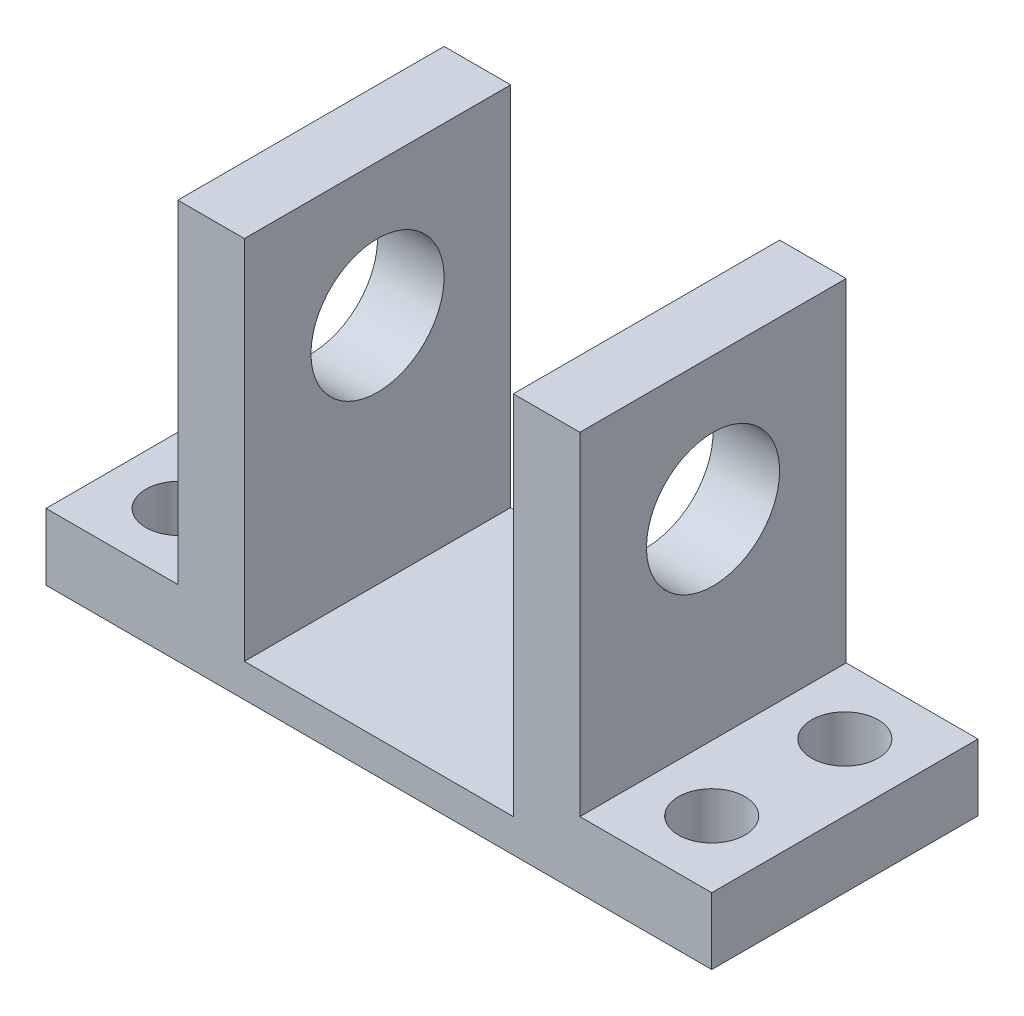
ISO-10303-21;
HEADER;
FILE_DESCRIPTION(('STEP AP214'),'2;1');
FILE_NAME('part.step','',(''),(''),'','','');
FILE_SCHEMA(('AUTOMOTIVE_DESIGN { 1 0 10303 214 1 1 1 1 }'));
ENDSEC;
DATA;
#1=APPLICATION_CONTEXT('core data for automotive mechanical design processes');
#2=APPLICATION_PROTOCOL_DEFINITION('international standard','automotive_design',2000,#1);
#3=PRODUCT_CONTEXT('',#1,'mechanical');
#4=PRODUCT('Part','Part','',(#3));
#5=PRODUCT_RELATED_PRODUCT_CATEGORY('part','',(#4));
#6=PRODUCT_DEFINITION_FORMATION('','',#4);
#7=PRODUCT_DEFINITION_CONTEXT('part definition',#1,'design');
#8=PRODUCT_DEFINITION('design','',#6,#7);
#9=PRODUCT_DEFINITION_SHAPE('','',#8);
#10=(LENGTH_UNIT() NAMED_UNIT(*) SI_UNIT(.MILLI.,.METRE.));
#11=(NAMED_UNIT(*) PLANE_ANGLE_UNIT() SI_UNIT($,.RADIAN.));
#12=(NAMED_UNIT(*) SI_UNIT($,.STERADIAN.) SOLID_ANGLE_UNIT());
#13=UNCERTAINTY_MEASURE_WITH_UNIT(LENGTH_MEASURE(1.E-05),#10,'distance_accuracy_value','');
#14=(GEOMETRIC_REPRESENTATION_CONTEXT(3) GLOBAL_UNCERTAINTY_ASSIGNED_CONTEXT((#13)) GLOBAL_UNIT_ASSIGNED_CONTEXT((#10,
#11,#12)) REPRESENTATION_CONTEXT('',''));
#15=CARTESIAN_POINT('',(0.,0.,0.));
#16=DIRECTION('',(0.,0.,1.));
#17=DIRECTION('',(1.,0.,0.));
#18=AXIS2_PLACEMENT_3D('',#15,#16,#17);
#19=CARTESIAN_POINT('',(-12.7,6.35,-25.4));
#20=DIRECTION('',(0.,-1.,0.));
#21=DIRECTION('',(0.,0.,-1.));
#22=AXIS2_PLACEMENT_3D('',#19,#20,#21);
#23=PLANE('',#22);
#24=CARTESIAN_POINT('',(-6.35,6.35,-6.35));
#25=DIRECTION('',(0.,1.,0.));
#26=DIRECTION('',(0.,0.,1.));
#27=AXIS2_PLACEMENT_3D('',#24,#25,#26);
#28=CIRCLE('',#27,3.175);
#29=CARTESIAN_POINT('',(-6.35,6.35,-3.175));
#30=VERTEX_POINT('',#29);
#31=EDGE_CURVE('E194',#30,#30,#28,.T.);
#32=ORIENTED_EDGE('',*,*,#31,.F.);
#33=EDGE_LOOP('',(#32));
#34=FACE_BOUND('',#33,.T.);
#35=CARTESIAN_POINT('',(-6.35,6.35,-19.05));
#36=DIRECTION('',(0.,1.,0.));
#37=DIRECTION('',(0.,0.,1.));
#38=AXIS2_PLACEMENT_3D('',#35,#36,#37);
#39=CIRCLE('',#38,3.175);
#40=CARTESIAN_POINT('',(-6.35,6.35,-15.875));
#41=VERTEX_POINT('',#40);
#42=EDGE_CURVE('E188',#41,#41,#39,.T.);
#43=ORIENTED_EDGE('',*,*,#42,.F.);
#44=EDGE_LOOP('',(#43));
#45=FACE_BOUND('',#44,.T.);
#46=DIRECTION('',(0.,0.,1.));
#47=VECTOR('',#46,1.);
#48=CARTESIAN_POINT('',(-0.127,6.35,-25.4));
#49=LINE('',#48,#47);
#50=CARTESIAN_POINT('',(-0.127,6.35,-25.4));
#51=VERTEX_POINT('',#50);
#52=CARTESIAN_POINT('',(-0.127,6.35,0.));
#53=VERTEX_POINT('',#52);
#54=EDGE_CURVE('E57',#51,#53,#49,.T.);
#55=ORIENTED_EDGE('',*,*,#54,.F.);
#56=DIRECTION('',(1.,0.,0.));
#57=VECTOR('',#56,1.);
#58=CARTESIAN_POINT('',(-12.7,6.35,-25.4));
#59=LINE('',#58,#57);
#60=CARTESIAN_POINT('',(-12.7,6.35,-25.4));
#61=VERTEX_POINT('',#60);
#62=EDGE_CURVE('E231',#61,#51,#59,.T.);
#63=ORIENTED_EDGE('',*,*,#62,.F.);
#64=DIRECTION('',(0.,0.,-1.));
#65=VECTOR('',#64,1.);
#66=CARTESIAN_POINT('',(-12.7,6.35,-25.4));
#67=LINE('',#66,#65);
#68=CARTESIAN_POINT('',(-12.7,6.35,0.));
#69=VERTEX_POINT('',#68);
#70=EDGE_CURVE('E229',#69,#61,#67,.T.);
#71=ORIENTED_EDGE('',*,*,#70,.F.);
#72=DIRECTION('',(1.,0.,0.));
#73=VECTOR('',#72,1.);
#74=CARTESIAN_POINT('',(-12.7,6.35,0.));
#75=LINE('',#74,#73);
#76=EDGE_CURVE('E53',#69,#53,#75,.T.);
#77=ORIENTED_EDGE('',*,*,#76,.T.);
#78=EDGE_LOOP('',(#55,#63,#71,#77));
#79=FACE_BOUND('',#78,.T.);
#80=ADVANCED_FACE('F36',(#34,#45,#79),#23,.F.);
#81=CARTESIAN_POINT('',(50.8,6.35,0.));
#82=DIRECTION('',(0.,-1.,0.));
#83=DIRECTION('',(0.,0.,-1.));
#84=AXIS2_PLACEMENT_3D('',#81,#82,#83);
#85=PLANE('',#84);
#86=CARTESIAN_POINT('',(44.45,6.35,-19.05));
#87=DIRECTION('',(0.,1.,0.));
#88=DIRECTION('',(0.,0.,1.));
#89=AXIS2_PLACEMENT_3D('',#86,#87,#88);
#90=CIRCLE('',#89,3.175);
#91=CARTESIAN_POINT('',(44.45,6.35,-15.875));
#92=VERTEX_POINT('',#91);
#93=EDGE_CURVE('E203',#92,#92,#90,.T.);
#94=ORIENTED_EDGE('',*,*,#93,.F.);
#95=EDGE_LOOP('',(#94));
#96=FACE_BOUND('',#95,.T.);
#97=CARTESIAN_POINT('',(44.45,6.35,-6.35));
#98=DIRECTION('',(0.,1.,0.));
#99=DIRECTION('',(0.,0.,1.));
#100=AXIS2_PLACEMENT_3D('',#97,#98,#99);
#101=CIRCLE('',#100,3.175);
#102=CARTESIAN_POINT('',(44.45,6.35,-3.175));
#103=VERTEX_POINT('',#102);
#104=EDGE_CURVE('E197',#103,#103,#101,.T.);
#105=ORIENTED_EDGE('',*,*,#104,.F.);
#106=EDGE_LOOP('',(#105));
#107=FACE_BOUND('',#106,.T.);
#108=DIRECTION('',(0.,0.,-1.));
#109=VECTOR('',#108,1.);
#110=CARTESIAN_POINT('',(38.227,6.35,0.));
#111=LINE('',#110,#109);
#112=CARTESIAN_POINT('',(38.227,6.35,0.));
#113=VERTEX_POINT('',#112);
#114=CARTESIAN_POINT('',(38.227,6.35,-25.4));
#115=VERTEX_POINT('',#114);
#116=EDGE_CURVE('E155',#113,#115,#111,.T.);
#117=ORIENTED_EDGE('',*,*,#116,.F.);
#118=DIRECTION('',(-1.,0.,0.));
#119=VECTOR('',#118,1.);
#120=CARTESIAN_POINT('',(50.8,6.35,0.));
#121=LINE('',#120,#119);
#122=CARTESIAN_POINT('',(50.8,6.35,0.));
#123=VERTEX_POINT('',#122);
#124=EDGE_CURVE('E219',#123,#113,#121,.T.);
#125=ORIENTED_EDGE('',*,*,#124,.F.);
#126=DIRECTION('',(0.,0.,1.));
#127=VECTOR('',#126,1.);
#128=CARTESIAN_POINT('',(50.8,6.35,0.));
#129=LINE('',#128,#127);
#130=CARTESIAN_POINT('',(50.8,6.35,-25.4));
#131=VERTEX_POINT('',#130);
#132=EDGE_CURVE('E217',#131,#123,#129,.T.);
#133=ORIENTED_EDGE('',*,*,#132,.F.);
#134=DIRECTION('',(-1.,0.,0.));
#135=VECTOR('',#134,1.);
#136=CARTESIAN_POINT('',(50.8,6.35,-25.4));
#137=LINE('',#136,#135);
#138=EDGE_CURVE('E224',#131,#115,#137,.T.);
#139=ORIENTED_EDGE('',*,*,#138,.T.);
#140=EDGE_LOOP('',(#117,#125,#133,#139));
#141=FACE_BOUND('',#140,.T.);
#142=ADVANCED_FACE('F263',(#96,#107,#141),#85,.F.);
#143=CARTESIAN_POINT('',(0.,38.1,-25.4));
#144=DIRECTION('',(0.,0.,-1.));
#145=DIRECTION('',(-1.,0.,0.));
#146=AXIS2_PLACEMENT_3D('',#143,#144,#145);
#147=PLANE('',#146);
#148=DIRECTION('',(1.,0.,0.));
#149=VECTOR('',#148,1.);
#150=CARTESIAN_POINT('',(0.,3.175,-25.4));
#151=LINE('',#150,#149);
#152=CARTESIAN_POINT('',(6.223,3.175,-25.4));
#153=VERTEX_POINT('',#152);
#154=CARTESIAN_POINT('',(31.877,3.175,-25.4));
#155=VERTEX_POINT('',#154);
#156=EDGE_CURVE('E241',#153,#155,#151,.T.);
#157=ORIENTED_EDGE('',*,*,#156,.T.);
#158=DIRECTION('',(0.,-1.,0.));
#159=VECTOR('',#158,1.);
#160=CARTESIAN_POINT('',(31.877,3.175,-25.4));
#161=LINE('',#160,#159);
#162=CARTESIAN_POINT('',(31.877,38.1,-25.4));
#163=VERTEX_POINT('',#162);
#164=EDGE_CURVE('E167',#163,#155,#161,.T.);
#165=ORIENTED_EDGE('',*,*,#164,.F.);
#166=DIRECTION('',(1.,0.,0.));
#167=VECTOR('',#166,1.);
#168=CARTESIAN_POINT('',(0.,38.1,-25.4));
#169=LINE('',#168,#167);
#170=CARTESIAN_POINT('',(38.227,38.1,-25.4));
#171=VERTEX_POINT('',#170);
#172=EDGE_CURVE('E234',#163,#171,#169,.T.);
#173=ORIENTED_EDGE('',*,*,#172,.T.);
#174=DIRECTION('',(0.,1.,0.));
#175=VECTOR('',#174,1.);
#176=CARTESIAN_POINT('',(38.227,6.35,-25.4));
#177=LINE('',#176,#175);
#178=EDGE_CURVE('E158',#115,#171,#177,.T.);
#179=ORIENTED_EDGE('',*,*,#178,.F.);
#180=ORIENTED_EDGE('',*,*,#138,.F.);
#181=DIRECTION('',(0.,1.,0.));
#182=VECTOR('',#181,1.);
#183=CARTESIAN_POINT('',(50.8,0.,-25.4));
#184=LINE('',#183,#182);
#185=CARTESIAN_POINT('',(50.8,0.,-25.4));
#186=VERTEX_POINT('',#185);
#187=EDGE_CURVE('E215',#186,#131,#184,.T.);
#188=ORIENTED_EDGE('',*,*,#187,.F.);
#189=DIRECTION('',(1.,0.,0.));
#190=VECTOR('',#189,1.);
#191=CARTESIAN_POINT('',(0.,0.,-25.4));
#192=LINE('',#191,#190);
#193=CARTESIAN_POINT('',(-12.7,0.,-25.4));
#194=VERTEX_POINT('',#193);
#195=EDGE_CURVE('E239',#194,#186,#192,.T.);
#196=ORIENTED_EDGE('',*,*,#195,.F.);
#197=DIRECTION('',(0.,-1.,0.));
#198=VECTOR('',#197,1.);
#199=CARTESIAN_POINT('',(-12.7,0.,-25.4));
#200=LINE('',#199,#198);
#201=EDGE_CURVE('E220',#61,#194,#200,.T.);
#202=ORIENTED_EDGE('',*,*,#201,.F.);
#203=ORIENTED_EDGE('',*,*,#62,.T.);
#204=DIRECTION('',(0.,-1.,0.));
#205=VECTOR('',#204,1.);
#206=CARTESIAN_POINT('',(-0.127,6.35,-25.4));
#207=LINE('',#206,#205);
#208=CARTESIAN_POINT('',(-0.127,38.1,-25.4));
#209=VERTEX_POINT('',#208);
#210=EDGE_CURVE('E290',#209,#51,#207,.T.);
#211=ORIENTED_EDGE('',*,*,#210,.F.);
#212=DIRECTION('',(1.,0.,0.));
#213=VECTOR('',#212,1.);
#214=CARTESIAN_POINT('',(0.,38.1,-25.4));
#215=LINE('',#214,#213);
#216=CARTESIAN_POINT('',(6.223,38.1,-25.4));
#217=VERTEX_POINT('',#216);
#218=EDGE_CURVE('E45',#209,#217,#215,.T.);
#219=ORIENTED_EDGE('',*,*,#218,.T.);
#220=DIRECTION('',(0.,1.,0.));
#221=VECTOR('',#220,1.);
#222=CARTESIAN_POINT('',(6.223,3.175,-25.4));
#223=LINE('',#222,#221);
#224=EDGE_CURVE('E184',#153,#217,#223,.T.);
#225=ORIENTED_EDGE('',*,*,#224,.F.);
#226=EDGE_LOOP('',(#157,#165,#173,#179,#180,#188,#196,#202,#203,#211,#219,#225));
#227=FACE_BOUND('',#226,.T.);
#228=ADVANCED_FACE('F38',(#227),#147,.T.);
#229=CARTESIAN_POINT('',(0.,38.1,0.));
#230=DIRECTION('',(0.,0.,-1.));
#231=DIRECTION('',(-1.,0.,0.));
#232=AXIS2_PLACEMENT_3D('',#229,#230,#231);
#233=PLANE('',#232);
#234=DIRECTION('',(0.,1.,0.));
#235=VECTOR('',#234,1.);
#236=CARTESIAN_POINT('',(31.877,3.175,0.));
#237=LINE('',#236,#235);
#238=CARTESIAN_POINT('',(31.877,3.175,0.));
#239=VERTEX_POINT('',#238);
#240=CARTESIAN_POINT('',(31.877,38.1,0.));
#241=VERTEX_POINT('',#240);
#242=EDGE_CURVE('E173',#239,#241,#237,.T.);
#243=ORIENTED_EDGE('',*,*,#242,.F.);
#244=DIRECTION('',(1.,0.,0.));
#245=VECTOR('',#244,1.);
#246=CARTESIAN_POINT('',(0.,3.175,0.));
#247=LINE('',#246,#245);
#248=CARTESIAN_POINT('',(6.223,3.175,0.));
#249=VERTEX_POINT('',#248);
#250=EDGE_CURVE('E236',#249,#239,#247,.T.);
#251=ORIENTED_EDGE('',*,*,#250,.F.);
#252=DIRECTION('',(0.,-1.,0.));
#253=VECTOR('',#252,1.);
#254=CARTESIAN_POINT('',(6.223,3.175,0.));
#255=LINE('',#254,#253);
#256=CARTESIAN_POINT('',(6.223,38.1,0.));
#257=VERTEX_POINT('',#256);
#258=EDGE_CURVE('E132',#257,#249,#255,.T.);
#259=ORIENTED_EDGE('',*,*,#258,.F.);
#260=DIRECTION('',(1.,0.,0.));
#261=VECTOR('',#260,1.);
#262=CARTESIAN_POINT('',(0.,38.1,0.));
#263=LINE('',#262,#261);
#264=CARTESIAN_POINT('',(-0.127,38.1,0.));
#265=VERTEX_POINT('',#264);
#266=EDGE_CURVE('E11',#265,#257,#263,.T.);
#267=ORIENTED_EDGE('',*,*,#266,.F.);
#268=DIRECTION('',(0.,1.,0.));
#269=VECTOR('',#268,1.);
#270=CARTESIAN_POINT('',(-0.127,6.35,0.));
#271=LINE('',#270,#269);
#272=EDGE_CURVE('E130',#53,#265,#271,.T.);
#273=ORIENTED_EDGE('',*,*,#272,.F.);
#274=ORIENTED_EDGE('',*,*,#76,.F.);
#275=DIRECTION('',(0.,1.,0.));
#276=VECTOR('',#275,1.);
#277=CARTESIAN_POINT('',(-12.7,0.,0.));
#278=LINE('',#277,#276);
#279=CARTESIAN_POINT('',(-12.7,0.,0.));
#280=VERTEX_POINT('',#279);
#281=EDGE_CURVE('E227',#280,#69,#278,.T.);
#282=ORIENTED_EDGE('',*,*,#281,.F.);
#283=DIRECTION('',(1.,0.,0.));
#284=VECTOR('',#283,1.);
#285=CARTESIAN_POINT('',(0.,0.,0.));
#286=LINE('',#285,#284);
#287=CARTESIAN_POINT('',(50.8,0.,0.));
#288=VERTEX_POINT('',#287);
#289=EDGE_CURVE('E237',#280,#288,#286,.T.);
#290=ORIENTED_EDGE('',*,*,#289,.T.);
#291=DIRECTION('',(0.,-1.,0.));
#292=VECTOR('',#291,1.);
#293=CARTESIAN_POINT('',(50.8,0.,0.));
#294=LINE('',#293,#292);
#295=EDGE_CURVE('E209',#123,#288,#294,.T.);
#296=ORIENTED_EDGE('',*,*,#295,.F.);
#297=ORIENTED_EDGE('',*,*,#124,.T.);
#298=DIRECTION('',(0.,-1.,0.));
#299=VECTOR('',#298,1.);
#300=CARTESIAN_POINT('',(38.227,6.35,0.));
#301=LINE('',#300,#299);
#302=CARTESIAN_POINT('',(38.227,38.1,0.));
#303=VERTEX_POINT('',#302);
#304=EDGE_CURVE('E149',#303,#113,#301,.T.);
#305=ORIENTED_EDGE('',*,*,#304,.F.);
#306=DIRECTION('',(1.,0.,0.));
#307=VECTOR('',#306,1.);
#308=CARTESIAN_POINT('',(0.,38.1,0.));
#309=LINE('',#308,#307);
#310=EDGE_CURVE('E232',#241,#303,#309,.T.);
#311=ORIENTED_EDGE('',*,*,#310,.F.);
#312=EDGE_LOOP('',(#243,#251,#259,#267,#273,#274,#282,#290,#296,#297,#305,#311));
#313=FACE_BOUND('',#312,.T.);
#314=ADVANCED_FACE('F129',(#313),#233,.F.);
#315=CARTESIAN_POINT('',(0.,38.1,0.));
#316=DIRECTION('',(0.,1.,0.));
#317=DIRECTION('',(0.,0.,1.));
#318=AXIS2_PLACEMENT_3D('',#315,#316,#317);
#319=PLANE('',#318);
#320=DIRECTION('',(0.,0.,1.));
#321=VECTOR('',#320,1.);
#322=CARTESIAN_POINT('',(6.223,38.1,0.));
#323=LINE('',#322,#321);
#324=EDGE_CURVE('E186',#217,#257,#323,.T.);
#325=ORIENTED_EDGE('',*,*,#324,.F.);
#326=ORIENTED_EDGE('',*,*,#218,.F.);
#327=DIRECTION('',(0.,0.,-1.));
#328=VECTOR('',#327,1.);
#329=CARTESIAN_POINT('',(-0.127,38.1,-25.4));
#330=LINE('',#329,#328);
#331=EDGE_CURVE('E141',#265,#209,#330,.T.);
#332=ORIENTED_EDGE('',*,*,#331,.F.);
#333=ORIENTED_EDGE('',*,*,#266,.T.);
#334=EDGE_LOOP('',(#325,#326,#332,#333));
#335=FACE_BOUND('',#334,.T.);
#336=ADVANCED_FACE('F144',(#335),#319,.T.);
#337=CARTESIAN_POINT('',(0.,0.,0.));
#338=DIRECTION('',(0.,1.,0.));
#339=DIRECTION('',(0.,0.,1.));
#340=AXIS2_PLACEMENT_3D('',#337,#338,#339);
#341=PLANE('',#340);
#342=CARTESIAN_POINT('',(-6.35,0.,-19.05));
#343=DIRECTION('',(0.,1.,0.));
#344=DIRECTION('',(0.,0.,1.));
#345=AXIS2_PLACEMENT_3D('',#342,#343,#344);
#346=CIRCLE('',#345,3.175);
#347=CARTESIAN_POINT('',(-6.35,0.,-15.875));
#348=VERTEX_POINT('',#347);
#349=EDGE_CURVE('E191',#348,#348,#346,.T.);
#350=ORIENTED_EDGE('',*,*,#349,.T.);
#351=EDGE_LOOP('',(#350));
#352=FACE_BOUND('',#351,.T.);
#353=CARTESIAN_POINT('',(-6.35,0.,-6.35));
#354=DIRECTION('',(0.,1.,0.));
#355=DIRECTION('',(0.,0.,1.));
#356=AXIS2_PLACEMENT_3D('',#353,#354,#355);
#357=CIRCLE('',#356,3.175);
#358=CARTESIAN_POINT('',(-6.35,0.,-3.175));
#359=VERTEX_POINT('',#358);
#360=EDGE_CURVE('E40',#359,#359,#357,.T.);
#361=ORIENTED_EDGE('',*,*,#360,.T.);
#362=EDGE_LOOP('',(#361));
#363=FACE_BOUND('',#362,.T.);
#364=CARTESIAN_POINT('',(44.45,0.,-6.35));
#365=DIRECTION('',(0.,1.,0.));
#366=DIRECTION('',(0.,0.,1.));
#367=AXIS2_PLACEMENT_3D('',#364,#365,#366);
#368=CIRCLE('',#367,3.17499999999999);
#369=CARTESIAN_POINT('',(44.45,0.,-3.175));
#370=VERTEX_POINT('',#369);
#371=EDGE_CURVE('E200',#370,#370,#368,.T.);
#372=ORIENTED_EDGE('',*,*,#371,.T.);
#373=EDGE_LOOP('',(#372));
#374=FACE_BOUND('',#373,.T.);
#375=CARTESIAN_POINT('',(44.45,0.,-19.05));
#376=DIRECTION('',(0.,1.,0.));
#377=DIRECTION('',(0.,0.,1.));
#378=AXIS2_PLACEMENT_3D('',#375,#376,#377);
#379=CIRCLE('',#378,3.17499999999999);
#380=CARTESIAN_POINT('',(44.45,0.,-15.875));
#381=VERTEX_POINT('',#380);
#382=EDGE_CURVE('E206',#381,#381,#379,.T.);
#383=ORIENTED_EDGE('',*,*,#382,.T.);
#384=EDGE_LOOP('',(#383));
#385=FACE_BOUND('',#384,.T.);
#386=ORIENTED_EDGE('',*,*,#195,.T.);
#387=DIRECTION('',(0.,0.,-1.));
#388=VECTOR('',#387,1.);
#389=CARTESIAN_POINT('',(50.8,0.,0.));
#390=LINE('',#389,#388);
#391=EDGE_CURVE('E212',#288,#186,#390,.T.);
#392=ORIENTED_EDGE('',*,*,#391,.F.);
#393=ORIENTED_EDGE('',*,*,#289,.F.);
#394=DIRECTION('',(0.,0.,1.));
#395=VECTOR('',#394,1.);
#396=CARTESIAN_POINT('',(-12.7,0.,-25.4));
#397=LINE('',#396,#395);
#398=EDGE_CURVE('E223',#194,#280,#397,.T.);
#399=ORIENTED_EDGE('',*,*,#398,.F.);
#400=EDGE_LOOP('',(#386,#392,#393,#399));
#401=FACE_BOUND('',#400,.T.);
#402=ADVANCED_FACE('F287',(#352,#363,#374,#385,#401),#341,.F.);
#403=CARTESIAN_POINT('',(0.,3.175,0.));
#404=DIRECTION('',(0.,1.,0.));
#405=DIRECTION('',(0.,0.,1.));
#406=AXIS2_PLACEMENT_3D('',#403,#404,#405);
#407=PLANE('',#406);
#408=ORIENTED_EDGE('',*,*,#250,.T.);
#409=DIRECTION('',(0.,0.,1.));
#410=VECTOR('',#409,1.);
#411=CARTESIAN_POINT('',(31.877,3.175,-25.4));
#412=LINE('',#411,#410);
#413=EDGE_CURVE('E170',#155,#239,#412,.T.);
#414=ORIENTED_EDGE('',*,*,#413,.F.);
#415=ORIENTED_EDGE('',*,*,#156,.F.);
#416=DIRECTION('',(0.,0.,-1.));
#417=VECTOR('',#416,1.);
#418=CARTESIAN_POINT('',(6.223,3.175,0.));
#419=LINE('',#418,#417);
#420=EDGE_CURVE('E181',#249,#153,#419,.T.);
#421=ORIENTED_EDGE('',*,*,#420,.F.);
#422=EDGE_LOOP('',(#408,#414,#415,#421));
#423=FACE_BOUND('',#422,.T.);
#424=ADVANCED_FACE('F323',(#423),#407,.T.);
#425=CARTESIAN_POINT('',(0.,38.1,0.));
#426=DIRECTION('',(0.,1.,0.));
#427=DIRECTION('',(0.,0.,1.));
#428=AXIS2_PLACEMENT_3D('',#425,#426,#427);
#429=PLANE('',#428);
#430=DIRECTION('',(0.,0.,-1.));
#431=VECTOR('',#430,1.);
#432=CARTESIAN_POINT('',(31.877,38.1,-25.4));
#433=LINE('',#432,#431);
#434=EDGE_CURVE('E175',#241,#163,#433,.T.);
#435=ORIENTED_EDGE('',*,*,#434,.F.);
#436=ORIENTED_EDGE('',*,*,#310,.T.);
#437=DIRECTION('',(0.,0.,1.));
#438=VECTOR('',#437,1.);
#439=CARTESIAN_POINT('',(38.227,38.1,0.));
#440=LINE('',#439,#438);
#441=EDGE_CURVE('E161',#171,#303,#440,.T.);
#442=ORIENTED_EDGE('',*,*,#441,.F.);
#443=ORIENTED_EDGE('',*,*,#172,.F.);
#444=EDGE_LOOP('',(#435,#436,#442,#443));
#445=FACE_BOUND('',#444,.T.);
#446=ADVANCED_FACE('F277',(#445),#429,.T.);
#447=CARTESIAN_POINT('',(38.1,25.4,-12.7));
#448=DIRECTION('',(-1.,0.,0.));
#449=DIRECTION('',(0.,0.,1.));
#450=AXIS2_PLACEMENT_3D('',#447,#448,#449);
#451=CYLINDRICAL_SURFACE('',#450,6.35);
#452=CARTESIAN_POINT('',(31.877,25.4,-12.7));
#453=DIRECTION('',(-1.,0.,0.));
#454=DIRECTION('',(0.,0.,1.));
#455=AXIS2_PLACEMENT_3D('',#452,#453,#454);
#456=CIRCLE('',#455,6.35);
#457=CARTESIAN_POINT('',(31.877,25.4,-6.35));
#458=VERTEX_POINT('',#457);
#459=EDGE_CURVE('E164',#458,#458,#456,.T.);
#460=CARTESIAN_POINT('',(38.227,25.4,-12.7));
#461=DIRECTION('',(1.,0.,0.));
#462=DIRECTION('',(0.,0.,-1.));
#463=AXIS2_PLACEMENT_3D('',#460,#461,#462);
#464=CIRCLE('',#463,6.35);
#465=CARTESIAN_POINT('',(38.227,25.4,-6.35));
#466=VERTEX_POINT('',#465);
#467=EDGE_CURVE('E146',#466,#466,#464,.T.);
#468=CARTESIAN_POINT('',(31.877,25.4,-6.35));
#469=CARTESIAN_POINT('',(31.9431458333333,25.4,-6.35));
#470=CARTESIAN_POINT('',(32.0092916666667,25.4,-6.35));
#471=CARTESIAN_POINT('',(32.1415833333333,25.4,-6.35));
#472=CARTESIAN_POINT('',(32.2077291666667,25.4,-6.35));
#473=CARTESIAN_POINT('',(32.3400208333333,25.4,-6.35));
#474=CARTESIAN_POINT('',(32.4061666666667,25.4,-6.35));
#475=CARTESIAN_POINT('',(32.5384583333333,25.4,-6.35));
#476=CARTESIAN_POINT('',(32.6046041666667,25.4,-6.35));
#477=CARTESIAN_POINT('',(32.7368958333333,25.4,-6.35));
#478=CARTESIAN_POINT('',(32.8030416666667,25.4,-6.35));
#479=CARTESIAN_POINT('',(32.9353333333333,25.4,-6.35));
#480=CARTESIAN_POINT('',(33.0014791666667,25.4,-6.35));
#481=CARTESIAN_POINT('',(33.1337708333333,25.4,-6.35));
#482=CARTESIAN_POINT('',(33.1999166666667,25.4,-6.35));
#483=CARTESIAN_POINT('',(33.3322083333333,25.4,-6.35));
#484=CARTESIAN_POINT('',(33.3983541666667,25.4,-6.35));
#485=CARTESIAN_POINT('',(33.5306458333333,25.4,-6.35));
#486=CARTESIAN_POINT('',(33.5967916666667,25.4,-6.35));
#487=CARTESIAN_POINT('',(33.7290833333333,25.4,-6.35));
#488=CARTESIAN_POINT('',(33.7952291666667,25.4,-6.35));
#489=CARTESIAN_POINT('',(33.9275208333333,25.4,-6.35));
#490=CARTESIAN_POINT('',(33.9936666666667,25.4,-6.35));
#491=CARTESIAN_POINT('',(34.1259583333333,25.4,-6.35));
#492=CARTESIAN_POINT('',(34.1921041666667,25.4,-6.35));
#493=CARTESIAN_POINT('',(34.3243958333333,25.4,-6.35));
#494=CARTESIAN_POINT('',(34.3905416666667,25.4,-6.35));
#495=CARTESIAN_POINT('',(34.5228333333333,25.4,-6.35));
#496=CARTESIAN_POINT('',(34.5889791666667,25.4,-6.35));
#497=CARTESIAN_POINT('',(34.7212708333333,25.4,-6.35));
#498=CARTESIAN_POINT('',(34.7874166666667,25.4,-6.35));
#499=CARTESIAN_POINT('',(34.9197083333333,25.4,-6.35));
#500=CARTESIAN_POINT('',(34.9858541666667,25.4,-6.35));
#501=CARTESIAN_POINT('',(35.1181458333333,25.4,-6.35));
#502=CARTESIAN_POINT('',(35.1842916666667,25.4,-6.35));
#503=CARTESIAN_POINT('',(35.3165833333333,25.4,-6.35));
#504=CARTESIAN_POINT('',(35.3827291666667,25.4,-6.35));
#505=CARTESIAN_POINT('',(35.5150208333333,25.4,-6.35));
#506=CARTESIAN_POINT('',(35.5811666666667,25.4,-6.35));
#507=CARTESIAN_POINT('',(35.7134583333333,25.4,-6.35));
#508=CARTESIAN_POINT('',(35.7796041666667,25.4,-6.35));
#509=CARTESIAN_POINT('',(35.9118958333333,25.4,-6.35));
#510=CARTESIAN_POINT('',(35.9780416666667,25.4,-6.35));
#511=CARTESIAN_POINT('',(36.1103333333333,25.4,-6.35));
#512=CARTESIAN_POINT('',(36.1764791666667,25.4,-6.35));
#513=CARTESIAN_POINT('',(36.3087708333333,25.4,-6.35));
#514=CARTESIAN_POINT('',(36.3749166666667,25.4,-6.35));
#515=CARTESIAN_POINT('',(36.5072083333333,25.4,-6.35));
#516=CARTESIAN_POINT('',(36.5733541666667,25.4,-6.35));
#517=CARTESIAN_POINT('',(36.7056458333333,25.4,-6.35));
#518=CARTESIAN_POINT('',(36.7717916666667,25.4,-6.35));
#519=CARTESIAN_POINT('',(36.9040833333333,25.4,-6.35));
#520=CARTESIAN_POINT('',(36.9702291666667,25.4,-6.35));
#521=CARTESIAN_POINT('',(37.1025208333333,25.4,-6.35));
#522=CARTESIAN_POINT('',(37.1686666666667,25.4,-6.35));
#523=CARTESIAN_POINT('',(37.3009583333333,25.4,-6.35));
#524=CARTESIAN_POINT('',(37.3671041666667,25.4,-6.35));
#525=CARTESIAN_POINT('',(37.4993958333333,25.4,-6.35));
#526=CARTESIAN_POINT('',(37.5655416666667,25.4,-6.35));
#527=CARTESIAN_POINT('',(37.6978333333333,25.4,-6.35));
#528=CARTESIAN_POINT('',(37.7639791666667,25.4,-6.35));
#529=CARTESIAN_POINT('',(37.8962708333333,25.4,-6.35));
#530=CARTESIAN_POINT('',(37.9624166666667,25.4,-6.35));
#531=CARTESIAN_POINT('',(38.0947083333333,25.4,-6.35));
#532=CARTESIAN_POINT('',(38.1608541666667,25.4,-6.35));
#533=CARTESIAN_POINT('',(38.227,25.4,-6.35));
#534=B_SPLINE_CURVE_WITH_KNOTS('',3,(#468,#469,#470,#471,#472,#473,#474,#475,#476,#477,#478,
#479,#480,#481,#482,#483,#484,#485,#486,#487,#488,#489,#490,#491,#492,#493,#494,#495,#496,#497,
#498,#499,#500,#501,#502,#503,#504,#505,#506,#507,#508,#509,#510,#511,#512,#513,#514,#515,#516,
#517,#518,#519,#520,#521,#522,#523,#524,#525,#526,#527,#528,#529,#530,#531,#532,#533),
.UNSPECIFIED.,.F.,.F.,(4,2,2,2,2,2,2,2,2,2,2,2,2,2,2,2,2,2,2,2,2,2,2,2,2,2,2,2,2,2,2,2,4),(0.,
0.198437499999995,0.396874999999998,0.595312499999993,0.793749999999996,0.992187499999998,
1.19062499999999,1.3890625,1.5875,1.78593749999999,1.984375,2.1828125,2.38124999999999,
2.5796875,2.77812499999999,2.97656249999999,3.175,3.37343749999999,3.571875,3.77031249999999,
3.96874999999999,4.1671875,4.36562499999999,4.56406249999999,4.7625,4.96093749999999,
5.15937499999999,5.35781249999999,5.55624999999999,5.75468749999999,5.95312499999999,
6.15156249999999,6.34999999999999),.UNSPECIFIED.);
#535=EDGE_CURVE('BSEAM317',#458,#466,#534,.T.);
#536=ORIENTED_EDGE('',*,*,#459,.T.);
#537=ORIENTED_EDGE('',*,*,#467,.T.);
#538=ORIENTED_EDGE('',*,*,#535,.T.);
#539=ORIENTED_EDGE('',*,*,#535,.F.);
#540=EDGE_LOOP('',(#536,#538,#537,#539));
#541=FACE_BOUND('',#540,.T.);
#542=ADVANCED_FACE('F317',(#541),#451,.F.);
#543=CARTESIAN_POINT('',(6.223,25.4,-12.7));
#544=DIRECTION('',(1.,0.,0.));
#545=DIRECTION('',(0.,0.,-1.));
#546=AXIS2_PLACEMENT_3D('',#543,#544,#545);
#547=CIRCLE('',#546,6.35);
#548=CARTESIAN_POINT('',(6.22299999999999,25.4,-6.35));
#549=VERTEX_POINT('',#548);
#550=EDGE_CURVE('E177',#549,#549,#547,.T.);
#551=CARTESIAN_POINT('',(-0.127,25.4,-12.7));
#552=DIRECTION('',(-1.,0.,0.));
#553=DIRECTION('',(0.,0.,1.));
#554=AXIS2_PLACEMENT_3D('',#551,#552,#553);
#555=CIRCLE('',#554,6.35);
#556=CARTESIAN_POINT('',(-0.127000000000002,25.4,-6.35));
#557=VERTEX_POINT('',#556);
#558=EDGE_CURVE('E291',#557,#557,#555,.T.);
#559=CARTESIAN_POINT('',(6.22299999999999,25.4,-6.35));
#560=CARTESIAN_POINT('',(6.15685416666666,25.4,-6.35));
#561=CARTESIAN_POINT('',(6.09070833333332,25.4,-6.35));
#562=CARTESIAN_POINT('',(5.95841666666666,25.4,-6.35));
#563=CARTESIAN_POINT('',(5.89227083333333,25.4,-6.35));
#564=CARTESIAN_POINT('',(5.75997916666666,25.4,-6.35));
#565=CARTESIAN_POINT('',(5.69383333333333,25.4,-6.35));
#566=CARTESIAN_POINT('',(5.56154166666666,25.4,-6.35));
#567=CARTESIAN_POINT('',(5.49539583333333,25.4,-6.35));
#568=CARTESIAN_POINT('',(5.36310416666666,25.4,-6.35));
#569=CARTESIAN_POINT('',(5.29695833333333,25.4,-6.35));
#570=CARTESIAN_POINT('',(5.16466666666666,25.4,-6.35));
#571=CARTESIAN_POINT('',(5.09852083333333,25.4,-6.35));
#572=CARTESIAN_POINT('',(4.96622916666666,25.4,-6.35));
#573=CARTESIAN_POINT('',(4.90008333333333,25.4,-6.35));
#574=CARTESIAN_POINT('',(4.76779166666666,25.4,-6.35));
#575=CARTESIAN_POINT('',(4.70164583333333,25.4,-6.35));
#576=CARTESIAN_POINT('',(4.56935416666666,25.4,-6.35));
#577=CARTESIAN_POINT('',(4.50320833333333,25.4,-6.35));
#578=CARTESIAN_POINT('',(4.37091666666666,25.4,-6.35));
#579=CARTESIAN_POINT('',(4.30477083333333,25.4,-6.35));
#580=CARTESIAN_POINT('',(4.17247916666666,25.4,-6.35));
#581=CARTESIAN_POINT('',(4.10633333333333,25.4,-6.35));
#582=CARTESIAN_POINT('',(3.97404166666666,25.4,-6.35));
#583=CARTESIAN_POINT('',(3.90789583333332,25.4,-6.35));
#584=CARTESIAN_POINT('',(3.77560416666666,25.4,-6.35));
#585=CARTESIAN_POINT('',(3.70945833333333,25.4,-6.35));
#586=CARTESIAN_POINT('',(3.57716666666666,25.4,-6.35));
#587=CARTESIAN_POINT('',(3.51102083333333,25.4,-6.35));
#588=CARTESIAN_POINT('',(3.37872916666666,25.4,-6.35));
#589=CARTESIAN_POINT('',(3.31258333333333,25.4,-6.35));
#590=CARTESIAN_POINT('',(3.18029166666666,25.4,-6.35));
#591=CARTESIAN_POINT('',(3.11414583333333,25.4,-6.35));
#592=CARTESIAN_POINT('',(2.98185416666666,25.4,-6.35));
#593=CARTESIAN_POINT('',(2.91570833333333,25.4,-6.35));
#594=CARTESIAN_POINT('',(2.78341666666666,25.4,-6.35));
#595=CARTESIAN_POINT('',(2.71727083333333,25.4,-6.35));
#596=CARTESIAN_POINT('',(2.58497916666666,25.4,-6.35));
#597=CARTESIAN_POINT('',(2.51883333333333,25.4,-6.35));
#598=CARTESIAN_POINT('',(2.38654166666666,25.4,-6.35));
#599=CARTESIAN_POINT('',(2.32039583333333,25.4,-6.35));
#600=CARTESIAN_POINT('',(2.18810416666666,25.4,-6.35));
#601=CARTESIAN_POINT('',(2.12195833333333,25.4,-6.35));
#602=CARTESIAN_POINT('',(1.98966666666666,25.4,-6.35));
#603=CARTESIAN_POINT('',(1.92352083333333,25.4,-6.35));
#604=CARTESIAN_POINT('',(1.79122916666666,25.4,-6.35));
#605=CARTESIAN_POINT('',(1.72508333333333,25.4,-6.35));
#606=CARTESIAN_POINT('',(1.59279166666666,25.4,-6.35));
#607=CARTESIAN_POINT('',(1.52664583333333,25.4,-6.35));
#608=CARTESIAN_POINT('',(1.39435416666666,25.4,-6.35));
#609=CARTESIAN_POINT('',(1.32820833333333,25.4,-6.35));
#610=CARTESIAN_POINT('',(1.19591666666666,25.4,-6.35));
#611=CARTESIAN_POINT('',(1.12977083333333,25.4,-6.35));
#612=CARTESIAN_POINT('',(0.997479166666664,25.4,-6.35));
#613=CARTESIAN_POINT('',(0.93133333333333,25.4,-6.35));
#614=CARTESIAN_POINT('',(0.799041666666662,25.4,-6.35));
#615=CARTESIAN_POINT('',(0.732895833333328,25.4,-6.35));
#616=CARTESIAN_POINT('',(0.600604166666662,25.4,-6.35));
#617=CARTESIAN_POINT('',(0.53445833333333,25.4,-6.35));
#618=CARTESIAN_POINT('',(0.402166666666664,25.4,-6.35));
#619=CARTESIAN_POINT('',(0.33602083333333,25.4,-6.35));
#620=CARTESIAN_POINT('',(0.203729166666664,25.4,-6.35));
#621=CARTESIAN_POINT('',(0.137583333333332,25.4,-6.35));
#622=CARTESIAN_POINT('',(0.00529166666666619,25.4,-6.35));
#623=CARTESIAN_POINT('',(-0.0608541666666679,25.4,-6.35));
#624=CARTESIAN_POINT('',(-0.127000000000002,25.4,-6.35));
#625=B_SPLINE_CURVE_WITH_KNOTS('',3,(#559,#560,#561,#562,#563,#564,#565,#566,#567,#568,#569,
#570,#571,#572,#573,#574,#575,#576,#577,#578,#579,#580,#581,#582,#583,#584,#585,#586,#587,#588,
#589,#590,#591,#592,#593,#594,#595,#596,#597,#598,#599,#600,#601,#602,#603,#604,#605,#606,#607,
#608,#609,#610,#611,#612,#613,#614,#615,#616,#617,#618,#619,#620,#621,#622,#623,#624),
.UNSPECIFIED.,.F.,.F.,(4,2,2,2,2,2,2,2,2,2,2,2,2,2,2,2,2,2,2,2,2,2,2,2,2,2,2,2,2,2,2,2,4),(0.,
0.198437500000002,0.396874999999998,0.5953125,0.793749999999996,0.992187499999998,1.190625,
1.3890625,1.5875,1.7859375,1.984375,2.1828125,2.38125,2.5796875,2.778125,2.97656249999999,3.175,
3.3734375,3.571875,3.7703125,3.96874999999999,4.1671875,4.365625,4.56406249999999,4.7625,
4.9609375,5.15937499999999,5.3578125,5.55625,5.75468749999999,5.953125,6.15156249999999,
6.34999999999999),.UNSPECIFIED.);
#626=EDGE_CURVE('BSEAM297',#549,#557,#625,.T.);
#627=ORIENTED_EDGE('',*,*,#550,.T.);
#628=ORIENTED_EDGE('',*,*,#558,.T.);
#629=ORIENTED_EDGE('',*,*,#626,.T.);
#630=ORIENTED_EDGE('',*,*,#626,.F.);
#631=EDGE_LOOP('',(#627,#629,#628,#630));
#632=FACE_BOUND('',#631,.T.);
#633=ADVANCED_FACE('F297',(#632),#451,.F.);
#634=CARTESIAN_POINT('',(-12.7,0.,0.));
#635=DIRECTION('',(1.,0.,0.));
#636=DIRECTION('',(0.,0.,-1.));
#637=AXIS2_PLACEMENT_3D('',#634,#635,#636);
#638=PLANE('',#637);
#639=ORIENTED_EDGE('',*,*,#201,.T.);
#640=ORIENTED_EDGE('',*,*,#398,.T.);
#641=ORIENTED_EDGE('',*,*,#281,.T.);
#642=ORIENTED_EDGE('',*,*,#70,.T.);
#643=EDGE_LOOP('',(#639,#640,#641,#642));
#644=FACE_BOUND('',#643,.T.);
#645=ADVANCED_FACE('F289',(#644),#638,.F.);
#646=CARTESIAN_POINT('',(50.8,0.,0.));
#647=DIRECTION('',(-1.,0.,0.));
#648=DIRECTION('',(0.,0.,1.));
#649=AXIS2_PLACEMENT_3D('',#646,#647,#648);
#650=PLANE('',#649);
#651=ORIENTED_EDGE('',*,*,#295,.T.);
#652=ORIENTED_EDGE('',*,*,#391,.T.);
#653=ORIENTED_EDGE('',*,*,#187,.T.);
#654=ORIENTED_EDGE('',*,*,#132,.T.);
#655=EDGE_LOOP('',(#651,#652,#653,#654));
#656=FACE_BOUND('',#655,.T.);
#657=ADVANCED_FACE('F283',(#656),#650,.F.);
#658=CARTESIAN_POINT('',(44.45,6.35,-19.05));
#659=DIRECTION('',(0.,1.,0.));
#660=DIRECTION('',(0.,0.,1.));
#661=AXIS2_PLACEMENT_3D('',#658,#659,#660);
#662=CYLINDRICAL_SURFACE('',#661,3.17499999999999);
#663=ORIENTED_EDGE('',*,*,#93,.T.);
#664=EDGE_LOOP('',(#663));
#665=FACE_BOUND('',#664,.T.);
#666=ORIENTED_EDGE('',*,*,#382,.F.);
#667=EDGE_LOOP('',(#666));
#668=FACE_BOUND('',#667,.T.);
#669=ADVANCED_FACE('F423',(#665,#668),#662,.F.);
#670=CARTESIAN_POINT('',(44.45,6.35,-6.35));
#671=DIRECTION('',(0.,1.,0.));
#672=DIRECTION('',(0.,0.,1.));
#673=AXIS2_PLACEMENT_3D('',#670,#671,#672);
#674=CYLINDRICAL_SURFACE('',#673,3.17499999999999);
#675=ORIENTED_EDGE('',*,*,#104,.T.);
#676=EDGE_LOOP('',(#675));
#677=FACE_BOUND('',#676,.T.);
#678=ORIENTED_EDGE('',*,*,#371,.F.);
#679=EDGE_LOOP('',(#678));
#680=FACE_BOUND('',#679,.T.);
#681=ADVANCED_FACE('F431',(#677,#680),#674,.F.);
#682=CARTESIAN_POINT('',(-6.35,6.35,-6.35));
#683=DIRECTION('',(0.,1.,0.));
#684=DIRECTION('',(0.,0.,1.));
#685=AXIS2_PLACEMENT_3D('',#682,#683,#684);
#686=CYLINDRICAL_SURFACE('',#685,3.175);
#687=ORIENTED_EDGE('',*,*,#31,.T.);
#688=EDGE_LOOP('',(#687));
#689=FACE_BOUND('',#688,.T.);
#690=ORIENTED_EDGE('',*,*,#360,.F.);
#691=EDGE_LOOP('',(#690));
#692=FACE_BOUND('',#691,.T.);
#693=ADVANCED_FACE('F439',(#689,#692),#686,.F.);
#694=CARTESIAN_POINT('',(-6.35,6.35,-19.05));
#695=DIRECTION('',(0.,1.,0.));
#696=DIRECTION('',(0.,0.,1.));
#697=AXIS2_PLACEMENT_3D('',#694,#695,#696);
#698=CYLINDRICAL_SURFACE('',#697,3.175);
#699=ORIENTED_EDGE('',*,*,#42,.T.);
#700=EDGE_LOOP('',(#699));
#701=FACE_BOUND('',#700,.T.);
#702=ORIENTED_EDGE('',*,*,#349,.F.);
#703=EDGE_LOOP('',(#702));
#704=FACE_BOUND('',#703,.T.);
#705=ADVANCED_FACE('F447',(#701,#704),#698,.F.);
#706=CARTESIAN_POINT('',(6.223,0.,0.));
#707=DIRECTION('',(-1.,0.,0.));
#708=DIRECTION('',(0.,0.,1.));
#709=AXIS2_PLACEMENT_3D('',#706,#707,#708);
#710=PLANE('',#709);
#711=ORIENTED_EDGE('',*,*,#550,.F.);
#712=EDGE_LOOP('',(#711));
#713=FACE_BOUND('',#712,.T.);
#714=ORIENTED_EDGE('',*,*,#258,.T.);
#715=ORIENTED_EDGE('',*,*,#420,.T.);
#716=ORIENTED_EDGE('',*,*,#224,.T.);
#717=ORIENTED_EDGE('',*,*,#324,.T.);
#718=EDGE_LOOP('',(#714,#715,#716,#717));
#719=FACE_BOUND('',#718,.T.);
#720=ADVANCED_FACE('F455',(#713,#719),#710,.F.);
#721=CARTESIAN_POINT('',(31.877,0.,0.));
#722=DIRECTION('',(1.,0.,0.));
#723=DIRECTION('',(0.,0.,-1.));
#724=AXIS2_PLACEMENT_3D('',#721,#722,#723);
#725=PLANE('',#724);
#726=ORIENTED_EDGE('',*,*,#459,.F.);
#727=EDGE_LOOP('',(#726));
#728=FACE_BOUND('',#727,.T.);
#729=ORIENTED_EDGE('',*,*,#164,.T.);
#730=ORIENTED_EDGE('',*,*,#413,.T.);
#731=ORIENTED_EDGE('',*,*,#242,.T.);
#732=ORIENTED_EDGE('',*,*,#434,.T.);
#733=EDGE_LOOP('',(#729,#730,#731,#732));
#734=FACE_BOUND('',#733,.T.);
#735=ADVANCED_FACE('F303',(#728,#734),#725,.F.);
#736=CARTESIAN_POINT('',(38.227,0.,0.));
#737=DIRECTION('',(-1.,0.,0.));
#738=DIRECTION('',(0.,0.,1.));
#739=AXIS2_PLACEMENT_3D('',#736,#737,#738);
#740=PLANE('',#739);
#741=ORIENTED_EDGE('',*,*,#304,.T.);
#742=ORIENTED_EDGE('',*,*,#116,.T.);
#743=ORIENTED_EDGE('',*,*,#178,.T.);
#744=ORIENTED_EDGE('',*,*,#441,.T.);
#745=EDGE_LOOP('',(#741,#742,#743,#744));
#746=FACE_BOUND('',#745,.T.);
#747=ORIENTED_EDGE('',*,*,#467,.F.);
#748=EDGE_LOOP('',(#747));
#749=FACE_BOUND('',#748,.T.);
#750=ADVANCED_FACE('F269',(#746,#749),#740,.F.);
#751=CARTESIAN_POINT('',(-0.127,0.,0.));
#752=DIRECTION('',(1.,0.,0.));
#753=DIRECTION('',(0.,0.,-1.));
#754=AXIS2_PLACEMENT_3D('',#751,#752,#753);
#755=PLANE('',#754);
#756=ORIENTED_EDGE('',*,*,#210,.T.);
#757=ORIENTED_EDGE('',*,*,#54,.T.);
#758=ORIENTED_EDGE('',*,*,#272,.T.);
#759=ORIENTED_EDGE('',*,*,#331,.T.);
#760=EDGE_LOOP('',(#756,#757,#758,#759));
#761=FACE_BOUND('',#760,.T.);
#762=ORIENTED_EDGE('',*,*,#558,.F.);
#763=EDGE_LOOP('',(#762));
#764=FACE_BOUND('',#763,.T.);
#765=ADVANCED_FACE('F139',(#761,#764),#755,.F.);
#766=CLOSED_SHELL('',(#80,#142,#228,#314,#336,#402,#424,#446,#542,#633,#645,#657,#669,#681,#693,
#705,#720,#735,#750,#765));
#767=MANIFOLD_SOLID_BREP('B2',#766);
#768=ADVANCED_BREP_SHAPE_REPRESENTATION('',(#18,#767),#14);
#769=SHAPE_DEFINITION_REPRESENTATION(#9,#768);
ENDSEC;
END-ISO-10303-21;
